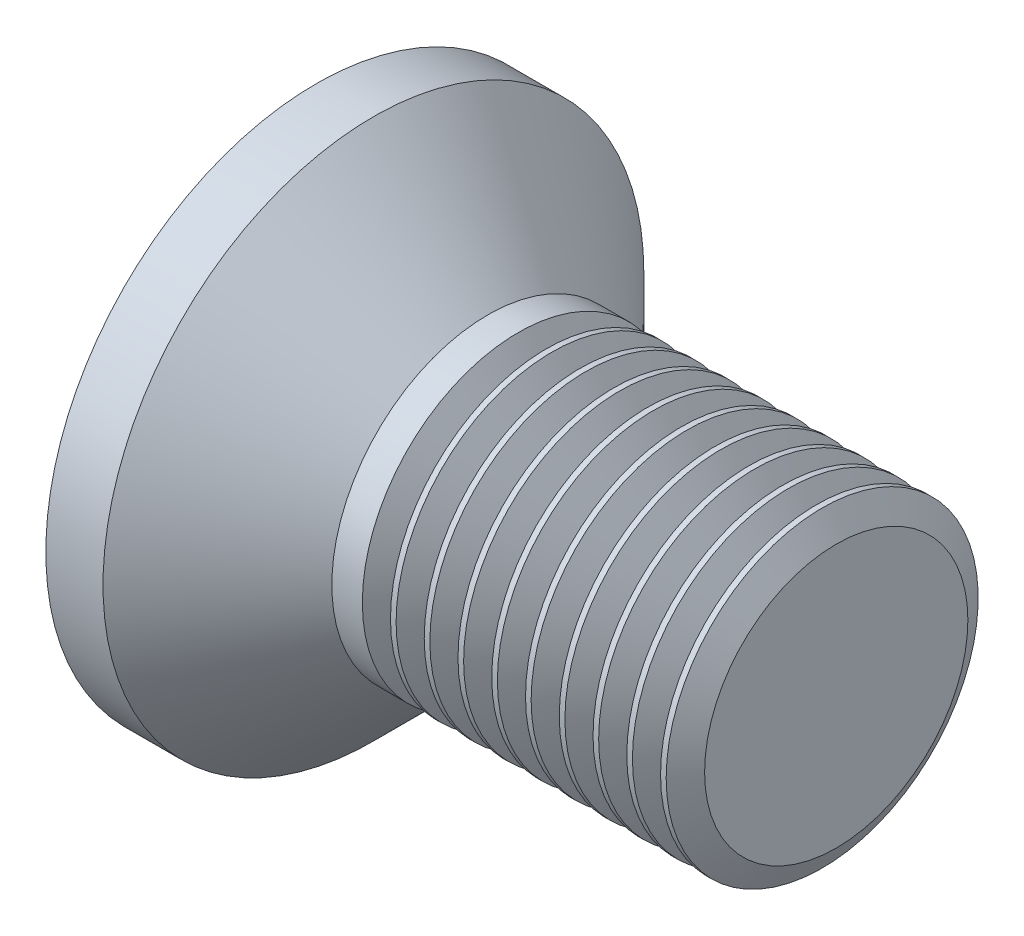
ISO-10303-21;
HEADER;
FILE_DESCRIPTION(('STEP AP214'),'2;1');
FILE_NAME('part.step','',(''),(''),'','','');
FILE_SCHEMA(('AUTOMOTIVE_DESIGN { 1 0 10303 214 1 1 1 1 }'));
ENDSEC;
DATA;
#1=APPLICATION_CONTEXT('core data for automotive mechanical design processes');
#2=APPLICATION_PROTOCOL_DEFINITION('international standard','automotive_design',2000,#1);
#3=PRODUCT_CONTEXT('',#1,'mechanical');
#4=PRODUCT('Part','Part','',(#3));
#5=PRODUCT_RELATED_PRODUCT_CATEGORY('part','',(#4));
#6=PRODUCT_DEFINITION_FORMATION('','',#4);
#7=PRODUCT_DEFINITION_CONTEXT('part definition',#1,'design');
#8=PRODUCT_DEFINITION('design','',#6,#7);
#9=PRODUCT_DEFINITION_SHAPE('','',#8);
#10=(LENGTH_UNIT() NAMED_UNIT(*) SI_UNIT(.MILLI.,.METRE.));
#11=(NAMED_UNIT(*) PLANE_ANGLE_UNIT() SI_UNIT($,.RADIAN.));
#12=(NAMED_UNIT(*) SI_UNIT($,.STERADIAN.) SOLID_ANGLE_UNIT());
#13=UNCERTAINTY_MEASURE_WITH_UNIT(LENGTH_MEASURE(1.E-05),#10,'distance_accuracy_value','');
#14=(GEOMETRIC_REPRESENTATION_CONTEXT(3) GLOBAL_UNCERTAINTY_ASSIGNED_CONTEXT((#13)) GLOBAL_UNIT_ASSIGNED_CONTEXT((#10,
#11,#12)) REPRESENTATION_CONTEXT('',''));
#15=CARTESIAN_POINT('',(0.,0.,0.));
#16=DIRECTION('',(0.,0.,1.));
#17=DIRECTION('',(1.,0.,0.));
#18=AXIS2_PLACEMENT_3D('',#15,#16,#17);
#19=CARTESIAN_POINT('',(4.51581291088132,0.,0.));
#20=DIRECTION('',(1.,0.,0.));
#21=DIRECTION('',(0.,0.,-1.));
#22=AXIS2_PLACEMENT_3D('',#19,#20,#21);
#23=CYLINDRICAL_SURFACE('',#22,1.5);
#24=CARTESIAN_POINT('',(2.26795,0.,0.));
#25=DIRECTION('',(-1.,0.,0.));
#26=DIRECTION('',(0.,0.,1.));
#27=AXIS2_PLACEMENT_3D('',#24,#25,#26);
#28=CIRCLE('',#27,1.5);
#29=CARTESIAN_POINT('',(2.26795,0.,1.5));
#30=VERTEX_POINT('',#29);
#31=EDGE_CURVE('E488',#30,#30,#28,.T.);
#32=ORIENTED_EDGE('',*,*,#31,.T.);
#33=EDGE_LOOP('',(#32));
#34=FACE_BOUND('',#33,.T.);
#35=CARTESIAN_POINT('',(2.21385,0.,0.));
#36=DIRECTION('',(-1.,0.,0.));
#37=DIRECTION('',(0.,0.,1.));
#38=AXIS2_PLACEMENT_3D('',#35,#36,#37);
#39=CIRCLE('',#38,1.5);
#40=CARTESIAN_POINT('',(2.21385,0.,1.5));
#41=VERTEX_POINT('',#40);
#42=EDGE_CURVE('E484',#41,#41,#39,.T.);
#43=ORIENTED_EDGE('',*,*,#42,.F.);
#44=EDGE_LOOP('',(#43));
#45=FACE_BOUND('',#44,.T.);
#46=ADVANCED_FACE('F37',(#34,#45),#23,.T.);
#47=CARTESIAN_POINT('',(2.59255,0.,0.));
#48=DIRECTION('',(-1.,0.,0.));
#49=DIRECTION('',(0.,0.,1.));
#50=AXIS2_PLACEMENT_3D('',#47,#48,#49);
#51=CIRCLE('',#50,1.5);
#52=CARTESIAN_POINT('',(2.59255,0.,1.5));
#53=VERTEX_POINT('',#52);
#54=EDGE_CURVE('E501',#53,#53,#51,.T.);
#55=ORIENTED_EDGE('',*,*,#54,.T.);
#56=EDGE_LOOP('',(#55));
#57=FACE_BOUND('',#56,.T.);
#58=CARTESIAN_POINT('',(2.53845,0.,0.));
#59=DIRECTION('',(-1.,0.,0.));
#60=DIRECTION('',(0.,0.,1.));
#61=AXIS2_PLACEMENT_3D('',#58,#59,#60);
#62=CIRCLE('',#61,1.5);
#63=CARTESIAN_POINT('',(2.53845,0.,1.5));
#64=VERTEX_POINT('',#63);
#65=EDGE_CURVE('E490',#64,#64,#62,.T.);
#66=ORIENTED_EDGE('',*,*,#65,.F.);
#67=EDGE_LOOP('',(#66));
#68=FACE_BOUND('',#67,.T.);
#69=ADVANCED_FACE('F242',(#57,#68),#23,.T.);
#70=CARTESIAN_POINT('',(2.91715,0.,0.));
#71=DIRECTION('',(-1.,0.,0.));
#72=DIRECTION('',(0.,0.,1.));
#73=AXIS2_PLACEMENT_3D('',#70,#71,#72);
#74=CIRCLE('',#73,1.5);
#75=CARTESIAN_POINT('',(2.91715,0.,1.5));
#76=VERTEX_POINT('',#75);
#77=EDGE_CURVE('E510',#76,#76,#74,.T.);
#78=ORIENTED_EDGE('',*,*,#77,.T.);
#79=EDGE_LOOP('',(#78));
#80=FACE_BOUND('',#79,.T.);
#81=CARTESIAN_POINT('',(2.86305,0.,0.));
#82=DIRECTION('',(-1.,0.,0.));
#83=DIRECTION('',(0.,0.,1.));
#84=AXIS2_PLACEMENT_3D('',#81,#82,#83);
#85=CIRCLE('',#84,1.5);
#86=CARTESIAN_POINT('',(2.86305,0.,1.5));
#87=VERTEX_POINT('',#86);
#88=EDGE_CURVE('E504',#87,#87,#85,.T.);
#89=ORIENTED_EDGE('',*,*,#88,.F.);
#90=EDGE_LOOP('',(#89));
#91=FACE_BOUND('',#90,.T.);
#92=ADVANCED_FACE('F250',(#80,#91),#23,.T.);
#93=CARTESIAN_POINT('',(3.24175,0.,0.));
#94=DIRECTION('',(-1.,0.,0.));
#95=DIRECTION('',(0.,0.,1.));
#96=AXIS2_PLACEMENT_3D('',#93,#94,#95);
#97=CIRCLE('',#96,1.5);
#98=CARTESIAN_POINT('',(3.24175,0.,1.5));
#99=VERTEX_POINT('',#98);
#100=EDGE_CURVE('E519',#99,#99,#97,.T.);
#101=ORIENTED_EDGE('',*,*,#100,.T.);
#102=EDGE_LOOP('',(#101));
#103=FACE_BOUND('',#102,.T.);
#104=CARTESIAN_POINT('',(3.18765,0.,0.));
#105=DIRECTION('',(-1.,0.,0.));
#106=DIRECTION('',(0.,0.,1.));
#107=AXIS2_PLACEMENT_3D('',#104,#105,#106);
#108=CIRCLE('',#107,1.5);
#109=CARTESIAN_POINT('',(3.18765,0.,1.5));
#110=VERTEX_POINT('',#109);
#111=EDGE_CURVE('E513',#110,#110,#108,.T.);
#112=ORIENTED_EDGE('',*,*,#111,.F.);
#113=EDGE_LOOP('',(#112));
#114=FACE_BOUND('',#113,.T.);
#115=ADVANCED_FACE('F559',(#103,#114),#23,.T.);
#116=CARTESIAN_POINT('',(3.56635,0.,0.));
#117=DIRECTION('',(-1.,0.,0.));
#118=DIRECTION('',(0.,0.,1.));
#119=AXIS2_PLACEMENT_3D('',#116,#117,#118);
#120=CIRCLE('',#119,1.5);
#121=CARTESIAN_POINT('',(3.56635,0.,1.5));
#122=VERTEX_POINT('',#121);
#123=EDGE_CURVE('E528',#122,#122,#120,.T.);
#124=ORIENTED_EDGE('',*,*,#123,.T.);
#125=EDGE_LOOP('',(#124));
#126=FACE_BOUND('',#125,.T.);
#127=CARTESIAN_POINT('',(3.51225,0.,0.));
#128=DIRECTION('',(-1.,0.,0.));
#129=DIRECTION('',(0.,0.,1.));
#130=AXIS2_PLACEMENT_3D('',#127,#128,#129);
#131=CIRCLE('',#130,1.5);
#132=CARTESIAN_POINT('',(3.51225,0.,1.5));
#133=VERTEX_POINT('',#132);
#134=EDGE_CURVE('E522',#133,#133,#131,.T.);
#135=ORIENTED_EDGE('',*,*,#134,.F.);
#136=EDGE_LOOP('',(#135));
#137=FACE_BOUND('',#136,.T.);
#138=ADVANCED_FACE('F550',(#126,#137),#23,.T.);
#139=CARTESIAN_POINT('',(3.89095,0.,0.));
#140=DIRECTION('',(-1.,0.,0.));
#141=DIRECTION('',(0.,0.,1.));
#142=AXIS2_PLACEMENT_3D('',#139,#140,#141);
#143=CIRCLE('',#142,1.5);
#144=CARTESIAN_POINT('',(3.89095,0.,1.5));
#145=VERTEX_POINT('',#144);
#146=EDGE_CURVE('E537',#145,#145,#143,.T.);
#147=ORIENTED_EDGE('',*,*,#146,.T.);
#148=EDGE_LOOP('',(#147));
#149=FACE_BOUND('',#148,.T.);
#150=CARTESIAN_POINT('',(3.83685,0.,0.));
#151=DIRECTION('',(-1.,0.,0.));
#152=DIRECTION('',(0.,0.,1.));
#153=AXIS2_PLACEMENT_3D('',#150,#151,#152);
#154=CIRCLE('',#153,1.5);
#155=CARTESIAN_POINT('',(3.83685,0.,1.5));
#156=VERTEX_POINT('',#155);
#157=EDGE_CURVE('E531',#156,#156,#154,.T.);
#158=ORIENTED_EDGE('',*,*,#157,.F.);
#159=EDGE_LOOP('',(#158));
#160=FACE_BOUND('',#159,.T.);
#161=ADVANCED_FACE('F286',(#149,#160),#23,.T.);
#162=CARTESIAN_POINT('',(4.21555,0.,0.));
#163=DIRECTION('',(-1.,0.,0.));
#164=DIRECTION('',(0.,0.,1.));
#165=AXIS2_PLACEMENT_3D('',#162,#163,#164);
#166=CIRCLE('',#165,1.5);
#167=CARTESIAN_POINT('',(4.21555,0.,1.5));
#168=VERTEX_POINT('',#167);
#169=EDGE_CURVE('E297',#168,#168,#166,.T.);
#170=ORIENTED_EDGE('',*,*,#169,.T.);
#171=EDGE_LOOP('',(#170));
#172=FACE_BOUND('',#171,.T.);
#173=CARTESIAN_POINT('',(4.16145,0.,0.));
#174=DIRECTION('',(-1.,0.,0.));
#175=DIRECTION('',(0.,0.,1.));
#176=AXIS2_PLACEMENT_3D('',#173,#174,#175);
#177=CIRCLE('',#176,1.5);
#178=CARTESIAN_POINT('',(4.16145,0.,1.5));
#179=VERTEX_POINT('',#178);
#180=EDGE_CURVE('E540',#179,#179,#177,.T.);
#181=ORIENTED_EDGE('',*,*,#180,.F.);
#182=EDGE_LOOP('',(#181));
#183=FACE_BOUND('',#182,.T.);
#184=ADVANCED_FACE('F277',(#172,#183),#23,.T.);
#185=CARTESIAN_POINT('',(4.54015,0.,0.));
#186=DIRECTION('',(-1.,0.,0.));
#187=DIRECTION('',(0.,0.,1.));
#188=AXIS2_PLACEMENT_3D('',#185,#186,#187);
#189=CIRCLE('',#188,1.5);
#190=CARTESIAN_POINT('',(4.54015,0.,1.5));
#191=VERTEX_POINT('',#190);
#192=EDGE_CURVE('E291',#191,#191,#189,.T.);
#193=ORIENTED_EDGE('',*,*,#192,.T.);
#194=EDGE_LOOP('',(#193));
#195=FACE_BOUND('',#194,.T.);
#196=CARTESIAN_POINT('',(4.48605,0.,0.));
#197=DIRECTION('',(-1.,0.,0.));
#198=DIRECTION('',(0.,0.,1.));
#199=AXIS2_PLACEMENT_3D('',#196,#197,#198);
#200=CIRCLE('',#199,1.5);
#201=CARTESIAN_POINT('',(4.48605,0.,1.5));
#202=VERTEX_POINT('',#201);
#203=EDGE_CURVE('E294',#202,#202,#200,.T.);
#204=ORIENTED_EDGE('',*,*,#203,.F.);
#205=EDGE_LOOP('',(#204));
#206=FACE_BOUND('',#205,.T.);
#207=ADVANCED_FACE('F262',(#195,#206),#23,.T.);
#208=CARTESIAN_POINT('',(4.54015,0.,0.));
#209=DIRECTION('',(-1.,0.,0.));
#210=DIRECTION('',(0.,0.,1.));
#211=AXIS2_PLACEMENT_3D('',#208,#209,#210);
#212=CONICAL_SURFACE('',#211,1.5,1.0471975511966);
#213=CARTESIAN_POINT('',(4.6754,0.,0.));
#214=DIRECTION('',(-1.,0.,0.));
#215=DIRECTION('',(0.,0.,1.));
#216=AXIS2_PLACEMENT_3D('',#213,#214,#215);
#217=CIRCLE('',#216,1.26574012827631);
#218=CARTESIAN_POINT('',(4.6754,0.,1.26574012827631));
#219=VERTEX_POINT('',#218);
#220=EDGE_CURVE('E310',#219,#219,#217,.T.);
#221=ORIENTED_EDGE('',*,*,#220,.T.);
#222=EDGE_LOOP('',(#221));
#223=FACE_BOUND('',#222,.T.);
#224=ORIENTED_EDGE('',*,*,#192,.F.);
#225=EDGE_LOOP('',(#224));
#226=FACE_BOUND('',#225,.T.);
#227=ADVANCED_FACE('F276',(#223,#226),#212,.T.);
#228=CARTESIAN_POINT('',(4.6754,0.,0.));
#229=DIRECTION('',(1.,0.,0.));
#230=DIRECTION('',(0.,0.,-1.));
#231=AXIS2_PLACEMENT_3D('',#228,#229,#230);
#232=CONICAL_SURFACE('',#231,1.26574012827631,1.0471975511966);
#233=CARTESIAN_POINT('',(4.81065,0.,0.));
#234=DIRECTION('',(-1.,0.,0.));
#235=DIRECTION('',(0.,0.,1.));
#236=AXIS2_PLACEMENT_3D('',#233,#234,#235);
#237=CIRCLE('',#236,1.5);
#238=CARTESIAN_POINT('',(4.81065,0.,1.5));
#239=VERTEX_POINT('',#238);
#240=EDGE_CURVE('E307',#239,#239,#237,.T.);
#241=ORIENTED_EDGE('',*,*,#240,.T.);
#242=EDGE_LOOP('',(#241));
#243=FACE_BOUND('',#242,.T.);
#244=ORIENTED_EDGE('',*,*,#220,.F.);
#245=EDGE_LOOP('',(#244));
#246=FACE_BOUND('',#245,.T.);
#247=ADVANCED_FACE('F283',(#243,#246),#232,.T.);
#248=CARTESIAN_POINT('',(5.,1.5,0.));
#249=DIRECTION('',(1.,0.,0.));
#250=DIRECTION('',(0.,0.,-1.));
#251=AXIS2_PLACEMENT_3D('',#248,#249,#250);
#252=PLANE('',#251);
#253=CARTESIAN_POINT('',(5.,0.,0.));
#254=DIRECTION('',(-1.,0.,0.));
#255=DIRECTION('',(0.,0.,1.));
#256=AXIS2_PLACEMENT_3D('',#253,#254,#255);
#257=CIRCLE('',#256,1.26574012827631);
#258=CARTESIAN_POINT('',(5.,0.,1.26574012827631));
#259=VERTEX_POINT('',#258);
#260=EDGE_CURVE('E161',#259,#259,#257,.T.);
#261=ORIENTED_EDGE('',*,*,#260,.F.);
#262=EDGE_LOOP('',(#261));
#263=FACE_BOUND('',#262,.T.);
#264=ADVANCED_FACE('F270',(#263),#252,.T.);
#265=CARTESIAN_POINT('',(4.86475,0.,0.));
#266=DIRECTION('',(-1.,0.,0.));
#267=DIRECTION('',(0.,0.,1.));
#268=AXIS2_PLACEMENT_3D('',#265,#266,#267);
#269=CONICAL_SURFACE('',#268,1.5,1.0471975511966);
#270=ORIENTED_EDGE('',*,*,#260,.T.);
#271=EDGE_LOOP('',(#270));
#272=FACE_BOUND('',#271,.T.);
#273=CARTESIAN_POINT('',(4.86475,0.,0.));
#274=DIRECTION('',(-1.,0.,0.));
#275=DIRECTION('',(0.,0.,1.));
#276=AXIS2_PLACEMENT_3D('',#273,#274,#275);
#277=CIRCLE('',#276,1.5);
#278=CARTESIAN_POINT('',(4.86475,0.,1.5));
#279=VERTEX_POINT('',#278);
#280=EDGE_CURVE('E313',#279,#279,#277,.T.);
#281=ORIENTED_EDGE('',*,*,#280,.F.);
#282=EDGE_LOOP('',(#281));
#283=FACE_BOUND('',#282,.T.);
#284=ADVANCED_FACE('F260',(#272,#283),#269,.T.);
#285=ORIENTED_EDGE('',*,*,#280,.T.);
#286=EDGE_LOOP('',(#285));
#287=FACE_BOUND('',#286,.T.);
#288=ORIENTED_EDGE('',*,*,#240,.F.);
#289=EDGE_LOOP('',(#288));
#290=FACE_BOUND('',#289,.T.);
#291=ADVANCED_FACE('F246',(#287,#290),#23,.T.);
#292=CARTESIAN_POINT('',(4.21555,0.,0.));
#293=DIRECTION('',(-1.,0.,0.));
#294=DIRECTION('',(0.,0.,1.));
#295=AXIS2_PLACEMENT_3D('',#292,#293,#294);
#296=CONICAL_SURFACE('',#295,1.5,1.0471975511966);
#297=CARTESIAN_POINT('',(4.3508,0.,0.));
#298=DIRECTION('',(-1.,0.,0.));
#299=DIRECTION('',(0.,0.,1.));
#300=AXIS2_PLACEMENT_3D('',#297,#298,#299);
#301=CIRCLE('',#300,1.26574012827631);
#302=CARTESIAN_POINT('',(4.3508,0.,1.26574012827631));
#303=VERTEX_POINT('',#302);
#304=EDGE_CURVE('E296',#303,#303,#301,.T.);
#305=ORIENTED_EDGE('',*,*,#304,.T.);
#306=EDGE_LOOP('',(#305));
#307=FACE_BOUND('',#306,.T.);
#308=ORIENTED_EDGE('',*,*,#169,.F.);
#309=EDGE_LOOP('',(#308));
#310=FACE_BOUND('',#309,.T.);
#311=ADVANCED_FACE('F259',(#307,#310),#296,.T.);
#312=CARTESIAN_POINT('',(4.3508,0.,0.));
#313=DIRECTION('',(1.,0.,0.));
#314=DIRECTION('',(0.,0.,-1.));
#315=AXIS2_PLACEMENT_3D('',#312,#313,#314);
#316=CONICAL_SURFACE('',#315,1.26574012827631,1.0471975511966);
#317=ORIENTED_EDGE('',*,*,#203,.T.);
#318=EDGE_LOOP('',(#317));
#319=FACE_BOUND('',#318,.T.);
#320=ORIENTED_EDGE('',*,*,#304,.F.);
#321=EDGE_LOOP('',(#320));
#322=FACE_BOUND('',#321,.T.);
#323=ADVANCED_FACE('F267',(#319,#322),#316,.T.);
#324=CARTESIAN_POINT('',(3.89095,0.,0.));
#325=DIRECTION('',(-1.,0.,0.));
#326=DIRECTION('',(0.,0.,1.));
#327=AXIS2_PLACEMENT_3D('',#324,#325,#326);
#328=CONICAL_SURFACE('',#327,1.5,1.0471975511966);
#329=CARTESIAN_POINT('',(4.0262,0.,0.));
#330=DIRECTION('',(-1.,0.,0.));
#331=DIRECTION('',(0.,0.,1.));
#332=AXIS2_PLACEMENT_3D('',#329,#330,#331);
#333=CIRCLE('',#332,1.26574012827631);
#334=CARTESIAN_POINT('',(4.0262,0.,1.26574012827631));
#335=VERTEX_POINT('',#334);
#336=EDGE_CURVE('E302',#335,#335,#333,.T.);
#337=ORIENTED_EDGE('',*,*,#336,.T.);
#338=EDGE_LOOP('',(#337));
#339=FACE_BOUND('',#338,.T.);
#340=ORIENTED_EDGE('',*,*,#146,.F.);
#341=EDGE_LOOP('',(#340));
#342=FACE_BOUND('',#341,.T.);
#343=ADVANCED_FACE('F425',(#339,#342),#328,.T.);
#344=CARTESIAN_POINT('',(4.0262,0.,0.));
#345=DIRECTION('',(1.,0.,0.));
#346=DIRECTION('',(0.,0.,-1.));
#347=AXIS2_PLACEMENT_3D('',#344,#345,#346);
#348=CONICAL_SURFACE('',#347,1.26574012827631,1.0471975511966);
#349=ORIENTED_EDGE('',*,*,#180,.T.);
#350=EDGE_LOOP('',(#349));
#351=FACE_BOUND('',#350,.T.);
#352=ORIENTED_EDGE('',*,*,#336,.F.);
#353=EDGE_LOOP('',(#352));
#354=FACE_BOUND('',#353,.T.);
#355=ADVANCED_FACE('F428',(#351,#354),#348,.T.);
#356=CARTESIAN_POINT('',(3.56635,0.,0.));
#357=DIRECTION('',(-1.,0.,0.));
#358=DIRECTION('',(0.,0.,1.));
#359=AXIS2_PLACEMENT_3D('',#356,#357,#358);
#360=CONICAL_SURFACE('',#359,1.5,1.0471975511966);
#361=CARTESIAN_POINT('',(3.7016,0.,0.));
#362=DIRECTION('',(-1.,0.,0.));
#363=DIRECTION('',(0.,0.,1.));
#364=AXIS2_PLACEMENT_3D('',#361,#362,#363);
#365=CIRCLE('',#364,1.26574012827631);
#366=CARTESIAN_POINT('',(3.7016,0.,1.26574012827631));
#367=VERTEX_POINT('',#366);
#368=EDGE_CURVE('E534',#367,#367,#365,.T.);
#369=ORIENTED_EDGE('',*,*,#368,.T.);
#370=EDGE_LOOP('',(#369));
#371=FACE_BOUND('',#370,.T.);
#372=ORIENTED_EDGE('',*,*,#123,.F.);
#373=EDGE_LOOP('',(#372));
#374=FACE_BOUND('',#373,.T.);
#375=ADVANCED_FACE('F432',(#371,#374),#360,.T.);
#376=CARTESIAN_POINT('',(3.7016,0.,0.));
#377=DIRECTION('',(1.,0.,0.));
#378=DIRECTION('',(0.,0.,-1.));
#379=AXIS2_PLACEMENT_3D('',#376,#377,#378);
#380=CONICAL_SURFACE('',#379,1.26574012827631,1.0471975511966);
#381=ORIENTED_EDGE('',*,*,#157,.T.);
#382=EDGE_LOOP('',(#381));
#383=FACE_BOUND('',#382,.T.);
#384=ORIENTED_EDGE('',*,*,#368,.F.);
#385=EDGE_LOOP('',(#384));
#386=FACE_BOUND('',#385,.T.);
#387=ADVANCED_FACE('F436',(#383,#386),#380,.T.);
#388=CARTESIAN_POINT('',(3.24175,0.,0.));
#389=DIRECTION('',(-1.,0.,0.));
#390=DIRECTION('',(0.,0.,1.));
#391=AXIS2_PLACEMENT_3D('',#388,#389,#390);
#392=CONICAL_SURFACE('',#391,1.5,1.0471975511966);
#393=CARTESIAN_POINT('',(3.377,0.,0.));
#394=DIRECTION('',(-1.,0.,0.));
#395=DIRECTION('',(0.,0.,1.));
#396=AXIS2_PLACEMENT_3D('',#393,#394,#395);
#397=CIRCLE('',#396,1.26574012827631);
#398=CARTESIAN_POINT('',(3.377,0.,1.26574012827631));
#399=VERTEX_POINT('',#398);
#400=EDGE_CURVE('E525',#399,#399,#397,.T.);
#401=ORIENTED_EDGE('',*,*,#400,.T.);
#402=EDGE_LOOP('',(#401));
#403=FACE_BOUND('',#402,.T.);
#404=ORIENTED_EDGE('',*,*,#100,.F.);
#405=EDGE_LOOP('',(#404));
#406=FACE_BOUND('',#405,.T.);
#407=ADVANCED_FACE('F440',(#403,#406),#392,.T.);
#408=CARTESIAN_POINT('',(3.377,0.,0.));
#409=DIRECTION('',(1.,0.,0.));
#410=DIRECTION('',(0.,0.,-1.));
#411=AXIS2_PLACEMENT_3D('',#408,#409,#410);
#412=CONICAL_SURFACE('',#411,1.26574012827631,1.0471975511966);
#413=ORIENTED_EDGE('',*,*,#134,.T.);
#414=EDGE_LOOP('',(#413));
#415=FACE_BOUND('',#414,.T.);
#416=ORIENTED_EDGE('',*,*,#400,.F.);
#417=EDGE_LOOP('',(#416));
#418=FACE_BOUND('',#417,.T.);
#419=ADVANCED_FACE('F444',(#415,#418),#412,.T.);
#420=CARTESIAN_POINT('',(2.91715,0.,0.));
#421=DIRECTION('',(-1.,0.,0.));
#422=DIRECTION('',(0.,0.,1.));
#423=AXIS2_PLACEMENT_3D('',#420,#421,#422);
#424=CONICAL_SURFACE('',#423,1.5,1.0471975511966);
#425=CARTESIAN_POINT('',(3.0524,0.,0.));
#426=DIRECTION('',(-1.,0.,0.));
#427=DIRECTION('',(0.,0.,1.));
#428=AXIS2_PLACEMENT_3D('',#425,#426,#427);
#429=CIRCLE('',#428,1.26574012827631);
#430=CARTESIAN_POINT('',(3.0524,0.,1.26574012827631));
#431=VERTEX_POINT('',#430);
#432=EDGE_CURVE('E516',#431,#431,#429,.T.);
#433=ORIENTED_EDGE('',*,*,#432,.T.);
#434=EDGE_LOOP('',(#433));
#435=FACE_BOUND('',#434,.T.);
#436=ORIENTED_EDGE('',*,*,#77,.F.);
#437=EDGE_LOOP('',(#436));
#438=FACE_BOUND('',#437,.T.);
#439=ADVANCED_FACE('F448',(#435,#438),#424,.T.);
#440=CARTESIAN_POINT('',(3.0524,0.,0.));
#441=DIRECTION('',(1.,0.,0.));
#442=DIRECTION('',(0.,0.,-1.));
#443=AXIS2_PLACEMENT_3D('',#440,#441,#442);
#444=CONICAL_SURFACE('',#443,1.26574012827631,1.0471975511966);
#445=ORIENTED_EDGE('',*,*,#111,.T.);
#446=EDGE_LOOP('',(#445));
#447=FACE_BOUND('',#446,.T.);
#448=ORIENTED_EDGE('',*,*,#432,.F.);
#449=EDGE_LOOP('',(#448));
#450=FACE_BOUND('',#449,.T.);
#451=ADVANCED_FACE('F452',(#447,#450),#444,.T.);
#452=CARTESIAN_POINT('',(2.59255,0.,0.));
#453=DIRECTION('',(-1.,0.,0.));
#454=DIRECTION('',(0.,0.,1.));
#455=AXIS2_PLACEMENT_3D('',#452,#453,#454);
#456=CONICAL_SURFACE('',#455,1.5,1.0471975511966);
#457=CARTESIAN_POINT('',(2.7278,0.,0.));
#458=DIRECTION('',(-1.,0.,0.));
#459=DIRECTION('',(0.,0.,1.));
#460=AXIS2_PLACEMENT_3D('',#457,#458,#459);
#461=CIRCLE('',#460,1.26574012827631);
#462=CARTESIAN_POINT('',(2.7278,0.,1.26574012827631));
#463=VERTEX_POINT('',#462);
#464=EDGE_CURVE('E507',#463,#463,#461,.T.);
#465=ORIENTED_EDGE('',*,*,#464,.T.);
#466=EDGE_LOOP('',(#465));
#467=FACE_BOUND('',#466,.T.);
#468=ORIENTED_EDGE('',*,*,#54,.F.);
#469=EDGE_LOOP('',(#468));
#470=FACE_BOUND('',#469,.T.);
#471=ADVANCED_FACE('F456',(#467,#470),#456,.T.);
#472=CARTESIAN_POINT('',(2.7278,0.,0.));
#473=DIRECTION('',(1.,0.,0.));
#474=DIRECTION('',(0.,0.,-1.));
#475=AXIS2_PLACEMENT_3D('',#472,#473,#474);
#476=CONICAL_SURFACE('',#475,1.26574012827631,1.0471975511966);
#477=ORIENTED_EDGE('',*,*,#88,.T.);
#478=EDGE_LOOP('',(#477));
#479=FACE_BOUND('',#478,.T.);
#480=ORIENTED_EDGE('',*,*,#464,.F.);
#481=EDGE_LOOP('',(#480));
#482=FACE_BOUND('',#481,.T.);
#483=ADVANCED_FACE('F460',(#479,#482),#476,.T.);
#484=CARTESIAN_POINT('',(2.26795,0.,0.));
#485=DIRECTION('',(-1.,0.,0.));
#486=DIRECTION('',(0.,0.,1.));
#487=AXIS2_PLACEMENT_3D('',#484,#485,#486);
#488=CONICAL_SURFACE('',#487,1.5,1.0471975511966);
#489=CARTESIAN_POINT('',(2.4032,0.,0.));
#490=DIRECTION('',(-1.,0.,0.));
#491=DIRECTION('',(0.,0.,1.));
#492=AXIS2_PLACEMENT_3D('',#489,#490,#491);
#493=CIRCLE('',#492,1.26574012827631);
#494=CARTESIAN_POINT('',(2.4032,0.,1.26574012827631));
#495=VERTEX_POINT('',#494);
#496=EDGE_CURVE('E498',#495,#495,#493,.T.);
#497=ORIENTED_EDGE('',*,*,#496,.T.);
#498=EDGE_LOOP('',(#497));
#499=FACE_BOUND('',#498,.T.);
#500=ORIENTED_EDGE('',*,*,#31,.F.);
#501=EDGE_LOOP('',(#500));
#502=FACE_BOUND('',#501,.T.);
#503=ADVANCED_FACE('F464',(#499,#502),#488,.T.);
#504=CARTESIAN_POINT('',(2.4032,0.,0.));
#505=DIRECTION('',(1.,0.,0.));
#506=DIRECTION('',(0.,0.,-1.));
#507=AXIS2_PLACEMENT_3D('',#504,#505,#506);
#508=CONICAL_SURFACE('',#507,1.26574012827631,1.0471975511966);
#509=ORIENTED_EDGE('',*,*,#65,.T.);
#510=EDGE_LOOP('',(#509));
#511=FACE_BOUND('',#510,.T.);
#512=ORIENTED_EDGE('',*,*,#496,.F.);
#513=EDGE_LOOP('',(#512));
#514=FACE_BOUND('',#513,.T.);
#515=ADVANCED_FACE('F468',(#511,#514),#508,.T.);
#516=CARTESIAN_POINT('',(1.94335,0.,0.));
#517=DIRECTION('',(-1.,0.,0.));
#518=DIRECTION('',(0.,0.,1.));
#519=AXIS2_PLACEMENT_3D('',#516,#517,#518);
#520=CONICAL_SURFACE('',#519,1.5,1.0471975511966);
#521=CARTESIAN_POINT('',(2.0786,0.,0.));
#522=DIRECTION('',(-1.,0.,0.));
#523=DIRECTION('',(0.,0.,1.));
#524=AXIS2_PLACEMENT_3D('',#521,#522,#523);
#525=CIRCLE('',#524,1.26574012827631);
#526=CARTESIAN_POINT('',(2.0786,0.,1.26574012827631));
#527=VERTEX_POINT('',#526);
#528=EDGE_CURVE('E487',#527,#527,#525,.T.);
#529=ORIENTED_EDGE('',*,*,#528,.T.);
#530=EDGE_LOOP('',(#529));
#531=FACE_BOUND('',#530,.T.);
#532=CARTESIAN_POINT('',(1.94335,0.,0.));
#533=DIRECTION('',(-1.,0.,0.));
#534=DIRECTION('',(0.,0.,1.));
#535=AXIS2_PLACEMENT_3D('',#532,#533,#534);
#536=CIRCLE('',#535,1.5);
#537=CARTESIAN_POINT('',(1.94335,0.,1.5));
#538=VERTEX_POINT('',#537);
#539=EDGE_CURVE('E492',#538,#538,#536,.T.);
#540=ORIENTED_EDGE('',*,*,#539,.F.);
#541=EDGE_LOOP('',(#540));
#542=FACE_BOUND('',#541,.T.);
#543=ADVANCED_FACE('F472',(#531,#542),#520,.T.);
#544=CARTESIAN_POINT('',(2.0786,0.,0.));
#545=DIRECTION('',(1.,0.,0.));
#546=DIRECTION('',(0.,0.,-1.));
#547=AXIS2_PLACEMENT_3D('',#544,#545,#546);
#548=CONICAL_SURFACE('',#547,1.26574012827631,1.0471975511966);
#549=ORIENTED_EDGE('',*,*,#42,.T.);
#550=EDGE_LOOP('',(#549));
#551=FACE_BOUND('',#550,.T.);
#552=ORIENTED_EDGE('',*,*,#528,.F.);
#553=EDGE_LOOP('',(#552));
#554=FACE_BOUND('',#553,.T.);
#555=ADVANCED_FACE('F418',(#551,#554),#548,.T.);
#556=CARTESIAN_POINT('',(0.825,0.32,0.32));
#557=DIRECTION('',(1.,0.,0.));
#558=DIRECTION('',(0.,0.,-1.));
#559=AXIS2_PLACEMENT_3D('',#556,#557,#558);
#560=PLANE('',#559);
#561=DIRECTION('',(0.,0.,1.));
#562=VECTOR('',#561,1.);
#563=CARTESIAN_POINT('',(0.825,0.32,0.32));
#564=LINE('',#563,#562);
#565=CARTESIAN_POINT('',(0.825,0.32,0.62));
#566=VERTEX_POINT('',#565);
#567=CARTESIAN_POINT('',(0.825,0.32,1.12368602791856));
#568=VERTEX_POINT('',#567);
#569=EDGE_CURVE('E174',#566,#568,#564,.T.);
#570=ORIENTED_EDGE('',*,*,#569,.F.);
#571=CARTESIAN_POINT('',(0.825,0.62,0.62));
#572=DIRECTION('',(1.,0.,0.));
#573=DIRECTION('',(0.,0.,-1.));
#574=AXIS2_PLACEMENT_3D('',#571,#572,#573);
#575=CIRCLE('',#574,0.3);
#576=CARTESIAN_POINT('',(0.825,0.62,0.32));
#577=VERTEX_POINT('',#576);
#578=EDGE_CURVE('E45',#566,#577,#575,.T.);
#579=ORIENTED_EDGE('',*,*,#578,.T.);
#580=DIRECTION('',(0.,-1.,0.));
#581=VECTOR('',#580,1.);
#582=CARTESIAN_POINT('',(0.825,0.32,0.32));
#583=LINE('',#582,#581);
#584=CARTESIAN_POINT('',(0.825,1.12368602791856,0.32));
#585=VERTEX_POINT('',#584);
#586=EDGE_CURVE('E221',#585,#577,#583,.T.);
#587=ORIENTED_EDGE('',*,*,#586,.F.);
#588=DIRECTION('',(0.,0.,1.));
#589=VECTOR('',#588,1.);
#590=CARTESIAN_POINT('',(0.825,1.12368602791856,-0.32));
#591=LINE('',#590,#589);
#592=CARTESIAN_POINT('',(0.825,1.12368602791856,-0.32));
#593=VERTEX_POINT('',#592);
#594=EDGE_CURVE('E229',#593,#585,#591,.T.);
#595=ORIENTED_EDGE('',*,*,#594,.F.);
#596=DIRECTION('',(0.,1.,0.));
#597=VECTOR('',#596,1.);
#598=CARTESIAN_POINT('',(0.825,0.32,-0.32));
#599=LINE('',#598,#597);
#600=CARTESIAN_POINT('',(0.825,0.62,-0.32));
#601=VERTEX_POINT('',#600);
#602=EDGE_CURVE('E333',#601,#593,#599,.T.);
#603=ORIENTED_EDGE('',*,*,#602,.F.);
#604=CARTESIAN_POINT('',(0.825,0.62,-0.62));
#605=DIRECTION('',(1.,0.,0.));
#606=DIRECTION('',(0.,0.,-1.));
#607=AXIS2_PLACEMENT_3D('',#604,#605,#606);
#608=CIRCLE('',#607,0.3);
#609=CARTESIAN_POINT('',(0.825,0.32,-0.62));
#610=VERTEX_POINT('',#609);
#611=EDGE_CURVE('E215',#601,#610,#608,.T.);
#612=ORIENTED_EDGE('',*,*,#611,.T.);
#613=DIRECTION('',(0.,0.,1.));
#614=VECTOR('',#613,1.);
#615=CARTESIAN_POINT('',(0.825,0.32,-0.32));
#616=LINE('',#615,#614);
#617=CARTESIAN_POINT('',(0.825,0.32,-1.12368602791856));
#618=VERTEX_POINT('',#617);
#619=EDGE_CURVE('E330',#618,#610,#616,.T.);
#620=ORIENTED_EDGE('',*,*,#619,.F.);
#621=DIRECTION('',(0.,1.,0.));
#622=VECTOR('',#621,1.);
#623=CARTESIAN_POINT('',(0.825,0.32,-1.12368602791856));
#624=LINE('',#623,#622);
#625=CARTESIAN_POINT('',(0.825,-0.32,-1.12368602791856));
#626=VERTEX_POINT('',#625);
#627=EDGE_CURVE('E329',#626,#618,#624,.T.);
#628=ORIENTED_EDGE('',*,*,#627,.F.);
#629=DIRECTION('',(0.,0.,-1.));
#630=VECTOR('',#629,1.);
#631=CARTESIAN_POINT('',(0.825,-0.32,-0.32));
#632=LINE('',#631,#630);
#633=CARTESIAN_POINT('',(0.825,-0.32,-0.62));
#634=VERTEX_POINT('',#633);
#635=EDGE_CURVE('E327',#634,#626,#632,.T.);
#636=ORIENTED_EDGE('',*,*,#635,.F.);
#637=CARTESIAN_POINT('',(0.825,-0.62,-0.62));
#638=DIRECTION('',(1.,0.,0.));
#639=DIRECTION('',(0.,0.,-1.));
#640=AXIS2_PLACEMENT_3D('',#637,#638,#639);
#641=CIRCLE('',#640,0.3);
#642=CARTESIAN_POINT('',(0.825,-0.62,-0.32));
#643=VERTEX_POINT('',#642);
#644=EDGE_CURVE('E213',#634,#643,#641,.T.);
#645=ORIENTED_EDGE('',*,*,#644,.T.);
#646=DIRECTION('',(0.,1.,0.));
#647=VECTOR('',#646,1.);
#648=CARTESIAN_POINT('',(0.825,-0.32,-0.32));
#649=LINE('',#648,#647);
#650=CARTESIAN_POINT('',(0.825,-1.12368602791856,-0.32));
#651=VERTEX_POINT('',#650);
#652=EDGE_CURVE('E324',#651,#643,#649,.T.);
#653=ORIENTED_EDGE('',*,*,#652,.F.);
#654=DIRECTION('',(0.,0.,-1.));
#655=VECTOR('',#654,1.);
#656=CARTESIAN_POINT('',(0.825,-1.12368602791856,-0.32));
#657=LINE('',#656,#655);
#658=CARTESIAN_POINT('',(0.825,-1.12368602791856,0.32));
#659=VERTEX_POINT('',#658);
#660=EDGE_CURVE('E323',#659,#651,#657,.T.);
#661=ORIENTED_EDGE('',*,*,#660,.F.);
#662=DIRECTION('',(0.,-1.,0.));
#663=VECTOR('',#662,1.);
#664=CARTESIAN_POINT('',(0.825,-0.32,0.32));
#665=LINE('',#664,#663);
#666=CARTESIAN_POINT('',(0.825,-0.62,0.32));
#667=VERTEX_POINT('',#666);
#668=EDGE_CURVE('E321',#667,#659,#665,.T.);
#669=ORIENTED_EDGE('',*,*,#668,.F.);
#670=CARTESIAN_POINT('',(0.825,-0.62,0.62));
#671=DIRECTION('',(1.,0.,0.));
#672=DIRECTION('',(0.,0.,-1.));
#673=AXIS2_PLACEMENT_3D('',#670,#671,#672);
#674=CIRCLE('',#673,0.3);
#675=CARTESIAN_POINT('',(0.825,-0.32,0.62));
#676=VERTEX_POINT('',#675);
#677=EDGE_CURVE('E11',#667,#676,#674,.T.);
#678=ORIENTED_EDGE('',*,*,#677,.T.);
#679=DIRECTION('',(0.,0.,-1.));
#680=VECTOR('',#679,1.);
#681=CARTESIAN_POINT('',(0.825,-0.32,0.32));
#682=LINE('',#681,#680);
#683=CARTESIAN_POINT('',(0.825,-0.32,1.12368602791856));
#684=VERTEX_POINT('',#683);
#685=EDGE_CURVE('E319',#684,#676,#682,.T.);
#686=ORIENTED_EDGE('',*,*,#685,.F.);
#687=DIRECTION('',(0.,-1.,0.));
#688=VECTOR('',#687,1.);
#689=CARTESIAN_POINT('',(0.825,0.32,1.12368602791856));
#690=LINE('',#689,#688);
#691=EDGE_CURVE('E185',#568,#684,#690,.T.);
#692=ORIENTED_EDGE('',*,*,#691,.F.);
#693=EDGE_LOOP('',(#570,#579,#587,#595,#603,#612,#620,#628,#636,#645,#653,#661,#669,#678,#686,#692));
#694=FACE_BOUND('',#693,.T.);
#695=ADVANCED_FACE('F219',(#694),#560,.F.);
#696=CARTESIAN_POINT('',(0.,-1.6,-0.32));
#697=DIRECTION('',(-0.500000000000001,0.866025403784438,0.));
#698=DIRECTION('',(-0.866025403784438,-0.500000000000001,0.));
#699=AXIS2_PLACEMENT_3D('',#696,#697,#698);
#700=PLANE('',#699);
#701=DIRECTION('',(0.,0.,-1.));
#702=VECTOR('',#701,1.);
#703=CARTESIAN_POINT('',(0.,-1.6,-0.32));
#704=LINE('',#703,#702);
#705=CARTESIAN_POINT('',(0.,-1.6,0.319999999999999));
#706=VERTEX_POINT('',#705);
#707=CARTESIAN_POINT('',(0.,-1.6,-0.32));
#708=VERTEX_POINT('',#707);
#709=EDGE_CURVE('E338',#706,#708,#704,.T.);
#710=ORIENTED_EDGE('',*,*,#709,.F.);
#711=DIRECTION('',(-0.866025403784438,-0.500000000000001,0.));
#712=VECTOR('',#711,1.);
#713=CARTESIAN_POINT('',(0.,-1.6,0.319999999999999));
#714=LINE('',#713,#712);
#715=EDGE_CURVE('E181',#659,#706,#714,.T.);
#716=ORIENTED_EDGE('',*,*,#715,.F.);
#717=ORIENTED_EDGE('',*,*,#660,.T.);
#718=DIRECTION('',(-0.866025403784438,-0.500000000000001,0.));
#719=VECTOR('',#718,1.);
#720=CARTESIAN_POINT('',(1.17300625842204,-0.922764520938918,-0.32));
#721=LINE('',#720,#719);
#722=EDGE_CURVE('E372',#651,#708,#721,.T.);
#723=ORIENTED_EDGE('',*,*,#722,.T.);
#724=EDGE_LOOP('',(#710,#716,#717,#723));
#725=FACE_BOUND('',#724,.T.);
#726=ADVANCED_FACE('F381',(#725),#700,.T.);
#727=CARTESIAN_POINT('',(0.825,-0.32,0.32));
#728=DIRECTION('',(0.,0.,-1.));
#729=DIRECTION('',(0.,1.,0.));
#730=AXIS2_PLACEMENT_3D('',#727,#728,#729);
#731=PLANE('',#730);
#732=DIRECTION('',(0.,-1.,0.));
#733=VECTOR('',#732,1.);
#734=CARTESIAN_POINT('',(0.,-0.32,0.32));
#735=LINE('',#734,#733);
#736=CARTESIAN_POINT('',(0.,-0.62,0.32));
#737=VERTEX_POINT('',#736);
#738=EDGE_CURVE('E336',#737,#706,#735,.T.);
#739=ORIENTED_EDGE('',*,*,#738,.F.);
#740=DIRECTION('',(-1.,0.,0.));
#741=VECTOR('',#740,1.);
#742=CARTESIAN_POINT('',(0.825,-0.62,0.32));
#743=LINE('',#742,#741);
#744=EDGE_CURVE('E52',#737,#667,#743,.F.);
#745=ORIENTED_EDGE('',*,*,#744,.T.);
#746=ORIENTED_EDGE('',*,*,#668,.T.);
#747=ORIENTED_EDGE('',*,*,#715,.T.);
#748=EDGE_LOOP('',(#739,#745,#746,#747));
#749=FACE_BOUND('',#748,.T.);
#750=ADVANCED_FACE('F378',(#749),#731,.T.);
#751=CARTESIAN_POINT('',(0.825,-0.62,0.62));
#752=DIRECTION('',(-1.,0.,0.));
#753=DIRECTION('',(0.,0.,1.));
#754=AXIS2_PLACEMENT_3D('',#751,#752,#753);
#755=CYLINDRICAL_SURFACE('',#754,0.3);
#756=ORIENTED_EDGE('',*,*,#677,.F.);
#757=ORIENTED_EDGE('',*,*,#744,.F.);
#758=CARTESIAN_POINT('',(0.,-0.62,0.62));
#759=DIRECTION('',(-1.,0.,0.));
#760=DIRECTION('',(0.,0.,1.));
#761=AXIS2_PLACEMENT_3D('',#758,#759,#760);
#762=CIRCLE('',#761,0.3);
#763=CARTESIAN_POINT('',(0.,-0.32,0.62));
#764=VERTEX_POINT('',#763);
#765=EDGE_CURVE('E189',#764,#737,#762,.T.);
#766=ORIENTED_EDGE('',*,*,#765,.F.);
#767=DIRECTION('',(-1.,0.,0.));
#768=VECTOR('',#767,1.);
#769=CARTESIAN_POINT('',(0.825,-0.32,0.62));
#770=LINE('',#769,#768);
#771=EDGE_CURVE('E209',#676,#764,#770,.T.);
#772=ORIENTED_EDGE('',*,*,#771,.F.);
#773=EDGE_LOOP('',(#756,#757,#766,#772));
#774=FACE_BOUND('',#773,.T.);
#775=ADVANCED_FACE('F39',(#774),#755,.T.);
#776=CARTESIAN_POINT('',(0.825,-0.32,0.32));
#777=DIRECTION('',(0.,1.,0.));
#778=DIRECTION('',(0.,0.,1.));
#779=AXIS2_PLACEMENT_3D('',#776,#777,#778);
#780=PLANE('',#779);
#781=ORIENTED_EDGE('',*,*,#685,.T.);
#782=ORIENTED_EDGE('',*,*,#771,.T.);
#783=DIRECTION('',(0.,0.,-1.));
#784=VECTOR('',#783,1.);
#785=CARTESIAN_POINT('',(0.,-0.32,0.32));
#786=LINE('',#785,#784);
#787=CARTESIAN_POINT('',(0.,-0.32,1.6));
#788=VERTEX_POINT('',#787);
#789=EDGE_CURVE('E170',#788,#764,#786,.T.);
#790=ORIENTED_EDGE('',*,*,#789,.F.);
#791=DIRECTION('',(-0.866025403784438,0.,0.500000000000001));
#792=VECTOR('',#791,1.);
#793=CARTESIAN_POINT('',(1.17300625842204,-0.32,0.922764520938917));
#794=LINE('',#793,#792);
#795=EDGE_CURVE('E168',#684,#788,#794,.T.);
#796=ORIENTED_EDGE('',*,*,#795,.F.);
#797=EDGE_LOOP('',(#781,#782,#790,#796));
#798=FACE_BOUND('',#797,.T.);
#799=ADVANCED_FACE('F387',(#798),#780,.T.);
#800=CARTESIAN_POINT('',(0.,0.32,1.6));
#801=DIRECTION('',(-0.500000000000001,0.,-0.866025403784438));
#802=DIRECTION('',(-0.866025403784438,0.,0.500000000000001));
#803=AXIS2_PLACEMENT_3D('',#800,#801,#802);
#804=PLANE('',#803);
#805=DIRECTION('',(0.,-1.,0.));
#806=VECTOR('',#805,1.);
#807=CARTESIAN_POINT('',(0.,0.32,1.6));
#808=LINE('',#807,#806);
#809=CARTESIAN_POINT('',(0.,0.32,1.6));
#810=VERTEX_POINT('',#809);
#811=EDGE_CURVE('E155',#810,#788,#808,.T.);
#812=ORIENTED_EDGE('',*,*,#811,.F.);
#813=DIRECTION('',(-0.866025403784438,0.,0.500000000000001));
#814=VECTOR('',#813,1.);
#815=CARTESIAN_POINT('',(0.,0.32,1.6));
#816=LINE('',#815,#814);
#817=EDGE_CURVE('E166',#568,#810,#816,.T.);
#818=ORIENTED_EDGE('',*,*,#817,.F.);
#819=ORIENTED_EDGE('',*,*,#691,.T.);
#820=ORIENTED_EDGE('',*,*,#795,.T.);
#821=EDGE_LOOP('',(#812,#818,#819,#820));
#822=FACE_BOUND('',#821,.T.);
#823=ADVANCED_FACE('F165',(#822),#804,.T.);
#824=CARTESIAN_POINT('',(0.825,0.32,0.32));
#825=DIRECTION('',(0.,-1.,0.));
#826=DIRECTION('',(0.,0.,-1.));
#827=AXIS2_PLACEMENT_3D('',#824,#825,#826);
#828=PLANE('',#827);
#829=DIRECTION('',(0.,0.,1.));
#830=VECTOR('',#829,1.);
#831=CARTESIAN_POINT('',(0.,0.32,0.32));
#832=LINE('',#831,#830);
#833=CARTESIAN_POINT('',(0.,0.32,0.62));
#834=VERTEX_POINT('',#833);
#835=EDGE_CURVE('E150',#834,#810,#832,.T.);
#836=ORIENTED_EDGE('',*,*,#835,.F.);
#837=DIRECTION('',(-1.,0.,0.));
#838=VECTOR('',#837,1.);
#839=CARTESIAN_POINT('',(0.825,0.32,0.62));
#840=LINE('',#839,#838);
#841=EDGE_CURVE('E207',#834,#566,#840,.F.);
#842=ORIENTED_EDGE('',*,*,#841,.T.);
#843=ORIENTED_EDGE('',*,*,#569,.T.);
#844=ORIENTED_EDGE('',*,*,#817,.T.);
#845=EDGE_LOOP('',(#836,#842,#843,#844));
#846=FACE_BOUND('',#845,.T.);
#847=ADVANCED_FACE('F172',(#846),#828,.T.);
#848=CARTESIAN_POINT('',(0.825,0.62,0.62));
#849=DIRECTION('',(-1.,0.,0.));
#850=DIRECTION('',(0.,0.,1.));
#851=AXIS2_PLACEMENT_3D('',#848,#849,#850);
#852=CYLINDRICAL_SURFACE('',#851,0.3);
#853=ORIENTED_EDGE('',*,*,#578,.F.);
#854=ORIENTED_EDGE('',*,*,#841,.F.);
#855=CARTESIAN_POINT('',(0.,0.62,0.62));
#856=DIRECTION('',(-1.,0.,0.));
#857=DIRECTION('',(0.,0.,1.));
#858=AXIS2_PLACEMENT_3D('',#855,#856,#857);
#859=CIRCLE('',#858,0.3);
#860=CARTESIAN_POINT('',(0.,0.62,0.32));
#861=VERTEX_POINT('',#860);
#862=EDGE_CURVE('E157',#861,#834,#859,.T.);
#863=ORIENTED_EDGE('',*,*,#862,.F.);
#864=DIRECTION('',(-1.,0.,0.));
#865=VECTOR('',#864,1.);
#866=CARTESIAN_POINT('',(0.825,0.62,0.32));
#867=LINE('',#866,#865);
#868=EDGE_CURVE('E204',#577,#861,#867,.T.);
#869=ORIENTED_EDGE('',*,*,#868,.F.);
#870=EDGE_LOOP('',(#853,#854,#863,#869));
#871=FACE_BOUND('',#870,.T.);
#872=ADVANCED_FACE('F231',(#871),#852,.T.);
#873=CARTESIAN_POINT('',(0.825,0.32,0.32));
#874=DIRECTION('',(0.,0.,-1.));
#875=DIRECTION('',(0.,1.,0.));
#876=AXIS2_PLACEMENT_3D('',#873,#874,#875);
#877=PLANE('',#876);
#878=ORIENTED_EDGE('',*,*,#586,.T.);
#879=ORIENTED_EDGE('',*,*,#868,.T.);
#880=DIRECTION('',(0.,-1.,0.));
#881=VECTOR('',#880,1.);
#882=CARTESIAN_POINT('',(0.,0.32,0.32));
#883=LINE('',#882,#881);
#884=CARTESIAN_POINT('',(0.,1.6,0.32));
#885=VERTEX_POINT('',#884);
#886=EDGE_CURVE('E318',#885,#861,#883,.T.);
#887=ORIENTED_EDGE('',*,*,#886,.F.);
#888=DIRECTION('',(-0.866025403784438,0.500000000000001,0.));
#889=VECTOR('',#888,1.);
#890=CARTESIAN_POINT('',(1.17300625842204,0.922764520938918,0.32));
#891=LINE('',#890,#889);
#892=EDGE_CURVE('E228',#585,#885,#891,.T.);
#893=ORIENTED_EDGE('',*,*,#892,.F.);
#894=EDGE_LOOP('',(#878,#879,#887,#893));
#895=FACE_BOUND('',#894,.T.);
#896=ADVANCED_FACE('F226',(#895),#877,.T.);
#897=CARTESIAN_POINT('',(0.,1.6,-0.32));
#898=DIRECTION('',(-0.500000000000001,-0.866025403784438,0.));
#899=DIRECTION('',(0.866025403784438,-0.500000000000001,0.));
#900=AXIS2_PLACEMENT_3D('',#897,#898,#899);
#901=PLANE('',#900);
#902=DIRECTION('',(0.,0.,1.));
#903=VECTOR('',#902,1.);
#904=CARTESIAN_POINT('',(0.,1.6,-0.32));
#905=LINE('',#904,#903);
#906=CARTESIAN_POINT('',(0.,1.6,-0.32));
#907=VERTEX_POINT('',#906);
#908=EDGE_CURVE('E353',#907,#885,#905,.T.);
#909=ORIENTED_EDGE('',*,*,#908,.F.);
#910=DIRECTION('',(-0.866025403784438,0.500000000000001,0.));
#911=VECTOR('',#910,1.);
#912=CARTESIAN_POINT('',(0.,1.6,-0.32));
#913=LINE('',#912,#911);
#914=EDGE_CURVE('E362',#593,#907,#913,.T.);
#915=ORIENTED_EDGE('',*,*,#914,.F.);
#916=ORIENTED_EDGE('',*,*,#594,.T.);
#917=ORIENTED_EDGE('',*,*,#892,.T.);
#918=EDGE_LOOP('',(#909,#915,#916,#917));
#919=FACE_BOUND('',#918,.T.);
#920=ADVANCED_FACE('F237',(#919),#901,.T.);
#921=CARTESIAN_POINT('',(0.825,0.32,-0.32));
#922=DIRECTION('',(0.,0.,1.));
#923=DIRECTION('',(1.,0.,0.));
#924=AXIS2_PLACEMENT_3D('',#921,#922,#923);
#925=PLANE('',#924);
#926=DIRECTION('',(0.,1.,0.));
#927=VECTOR('',#926,1.);
#928=CARTESIAN_POINT('',(0.,0.32,-0.32));
#929=LINE('',#928,#927);
#930=CARTESIAN_POINT('',(0.,0.62,-0.32));
#931=VERTEX_POINT('',#930);
#932=EDGE_CURVE('E351',#931,#907,#929,.T.);
#933=ORIENTED_EDGE('',*,*,#932,.F.);
#934=DIRECTION('',(-1.,0.,0.));
#935=VECTOR('',#934,1.);
#936=CARTESIAN_POINT('',(0.825,0.62,-0.32));
#937=LINE('',#936,#935);
#938=EDGE_CURVE('E202',#931,#601,#937,.F.);
#939=ORIENTED_EDGE('',*,*,#938,.T.);
#940=ORIENTED_EDGE('',*,*,#602,.T.);
#941=ORIENTED_EDGE('',*,*,#914,.T.);
#942=EDGE_LOOP('',(#933,#939,#940,#941));
#943=FACE_BOUND('',#942,.T.);
#944=ADVANCED_FACE('F413',(#943),#925,.T.);
#945=CARTESIAN_POINT('',(0.825,0.62,-0.62));
#946=DIRECTION('',(-1.,0.,0.));
#947=DIRECTION('',(0.,0.,1.));
#948=AXIS2_PLACEMENT_3D('',#945,#946,#947);
#949=CYLINDRICAL_SURFACE('',#948,0.3);
#950=ORIENTED_EDGE('',*,*,#611,.F.);
#951=ORIENTED_EDGE('',*,*,#938,.F.);
#952=CARTESIAN_POINT('',(0.,0.62,-0.62));
#953=DIRECTION('',(-1.,0.,0.));
#954=DIRECTION('',(0.,0.,1.));
#955=AXIS2_PLACEMENT_3D('',#952,#953,#954);
#956=CIRCLE('',#955,0.3);
#957=CARTESIAN_POINT('',(0.,0.32,-0.62));
#958=VERTEX_POINT('',#957);
#959=EDGE_CURVE('E193',#958,#931,#956,.T.);
#960=ORIENTED_EDGE('',*,*,#959,.F.);
#961=DIRECTION('',(-1.,0.,0.));
#962=VECTOR('',#961,1.);
#963=CARTESIAN_POINT('',(0.825,0.32,-0.62));
#964=LINE('',#963,#962);
#965=EDGE_CURVE('E199',#610,#958,#964,.T.);
#966=ORIENTED_EDGE('',*,*,#965,.F.);
#967=EDGE_LOOP('',(#950,#951,#960,#966));
#968=FACE_BOUND('',#967,.T.);
#969=ADVANCED_FACE('F411',(#968),#949,.T.);
#970=CARTESIAN_POINT('',(0.825,0.32,-0.32));
#971=DIRECTION('',(0.,-1.,0.));
#972=DIRECTION('',(0.,0.,-1.));
#973=AXIS2_PLACEMENT_3D('',#970,#971,#972);
#974=PLANE('',#973);
#975=ORIENTED_EDGE('',*,*,#619,.T.);
#976=ORIENTED_EDGE('',*,*,#965,.T.);
#977=DIRECTION('',(0.,0.,1.));
#978=VECTOR('',#977,1.);
#979=CARTESIAN_POINT('',(0.,0.32,-0.32));
#980=LINE('',#979,#978);
#981=CARTESIAN_POINT('',(0.,0.32,-1.6));
#982=VERTEX_POINT('',#981);
#983=EDGE_CURVE('E348',#982,#958,#980,.T.);
#984=ORIENTED_EDGE('',*,*,#983,.F.);
#985=DIRECTION('',(-0.866025403784438,0.,-0.500000000000001));
#986=VECTOR('',#985,1.);
#987=CARTESIAN_POINT('',(1.17300625842204,0.32,-0.922764520938918));
#988=LINE('',#987,#986);
#989=EDGE_CURVE('E366',#618,#982,#988,.T.);
#990=ORIENTED_EDGE('',*,*,#989,.F.);
#991=EDGE_LOOP('',(#975,#976,#984,#990));
#992=FACE_BOUND('',#991,.T.);
#993=ADVANCED_FACE('F408',(#992),#974,.T.);
#994=CARTESIAN_POINT('',(0.,0.32,-1.6));
#995=DIRECTION('',(-0.500000000000001,0.,0.866025403784438));
#996=DIRECTION('',(0.866025403784438,0.,0.500000000000001));
#997=AXIS2_PLACEMENT_3D('',#994,#995,#996);
#998=PLANE('',#997);
#999=DIRECTION('',(0.,1.,0.));
#1000=VECTOR('',#999,1.);
#1001=CARTESIAN_POINT('',(0.,0.32,-1.6));
#1002=LINE('',#1001,#1000);
#1003=CARTESIAN_POINT('',(0.,-0.32,-1.6));
#1004=VERTEX_POINT('',#1003);
#1005=EDGE_CURVE('E345',#1004,#982,#1002,.T.);
#1006=ORIENTED_EDGE('',*,*,#1005,.F.);
#1007=DIRECTION('',(-0.866025403784438,0.,-0.500000000000001));
#1008=VECTOR('',#1007,1.);
#1009=CARTESIAN_POINT('',(0.,-0.32,-1.6));
#1010=LINE('',#1009,#1008);
#1011=EDGE_CURVE('E368',#626,#1004,#1010,.T.);
#1012=ORIENTED_EDGE('',*,*,#1011,.F.);
#1013=ORIENTED_EDGE('',*,*,#627,.T.);
#1014=ORIENTED_EDGE('',*,*,#989,.T.);
#1015=EDGE_LOOP('',(#1006,#1012,#1013,#1014));
#1016=FACE_BOUND('',#1015,.T.);
#1017=ADVANCED_FACE('F406',(#1016),#998,.T.);
#1018=CARTESIAN_POINT('',(0.825,-0.32,-0.32));
#1019=DIRECTION('',(0.,1.,0.));
#1020=DIRECTION('',(0.,0.,1.));
#1021=AXIS2_PLACEMENT_3D('',#1018,#1019,#1020);
#1022=PLANE('',#1021);
#1023=DIRECTION('',(0.,0.,-1.));
#1024=VECTOR('',#1023,1.);
#1025=CARTESIAN_POINT('',(0.,-0.32,-0.32));
#1026=LINE('',#1025,#1024);
#1027=CARTESIAN_POINT('',(0.,-0.32,-0.62));
#1028=VERTEX_POINT('',#1027);
#1029=EDGE_CURVE('E343',#1028,#1004,#1026,.T.);
#1030=ORIENTED_EDGE('',*,*,#1029,.F.);
#1031=DIRECTION('',(-1.,0.,0.));
#1032=VECTOR('',#1031,1.);
#1033=CARTESIAN_POINT('',(0.825,-0.32,-0.62));
#1034=LINE('',#1033,#1032);
#1035=EDGE_CURVE('E197',#1028,#634,#1034,.F.);
#1036=ORIENTED_EDGE('',*,*,#1035,.T.);
#1037=ORIENTED_EDGE('',*,*,#635,.T.);
#1038=ORIENTED_EDGE('',*,*,#1011,.T.);
#1039=EDGE_LOOP('',(#1030,#1036,#1037,#1038));
#1040=FACE_BOUND('',#1039,.T.);
#1041=ADVANCED_FACE('F403',(#1040),#1022,.T.);
#1042=CARTESIAN_POINT('',(0.825,-0.62,-0.62));
#1043=DIRECTION('',(-1.,0.,0.));
#1044=DIRECTION('',(0.,0.,1.));
#1045=AXIS2_PLACEMENT_3D('',#1042,#1043,#1044);
#1046=CYLINDRICAL_SURFACE('',#1045,0.3);
#1047=ORIENTED_EDGE('',*,*,#644,.F.);
#1048=ORIENTED_EDGE('',*,*,#1035,.F.);
#1049=CARTESIAN_POINT('',(0.,-0.62,-0.62));
#1050=DIRECTION('',(-1.,0.,0.));
#1051=DIRECTION('',(0.,0.,1.));
#1052=AXIS2_PLACEMENT_3D('',#1049,#1050,#1051);
#1053=CIRCLE('',#1052,0.3);
#1054=CARTESIAN_POINT('',(0.,-0.62,-0.32));
#1055=VERTEX_POINT('',#1054);
#1056=EDGE_CURVE('E195',#1055,#1028,#1053,.T.);
#1057=ORIENTED_EDGE('',*,*,#1056,.F.);
#1058=DIRECTION('',(-1.,0.,0.));
#1059=VECTOR('',#1058,1.);
#1060=CARTESIAN_POINT('',(0.825,-0.62,-0.32));
#1061=LINE('',#1060,#1059);
#1062=EDGE_CURVE('E186',#643,#1055,#1061,.T.);
#1063=ORIENTED_EDGE('',*,*,#1062,.F.);
#1064=EDGE_LOOP('',(#1047,#1048,#1057,#1063));
#1065=FACE_BOUND('',#1064,.T.);
#1066=ADVANCED_FACE('F401',(#1065),#1046,.T.);
#1067=CARTESIAN_POINT('',(0.825,-0.32,-0.32));
#1068=DIRECTION('',(0.,0.,1.));
#1069=DIRECTION('',(1.,0.,0.));
#1070=AXIS2_PLACEMENT_3D('',#1067,#1068,#1069);
#1071=PLANE('',#1070);
#1072=ORIENTED_EDGE('',*,*,#652,.T.);
#1073=ORIENTED_EDGE('',*,*,#1062,.T.);
#1074=DIRECTION('',(0.,1.,0.));
#1075=VECTOR('',#1074,1.);
#1076=CARTESIAN_POINT('',(0.,-0.32,-0.32));
#1077=LINE('',#1076,#1075);
#1078=EDGE_CURVE('E341',#708,#1055,#1077,.T.);
#1079=ORIENTED_EDGE('',*,*,#1078,.F.);
#1080=ORIENTED_EDGE('',*,*,#722,.F.);
#1081=EDGE_LOOP('',(#1072,#1073,#1079,#1080));
#1082=FACE_BOUND('',#1081,.T.);
#1083=ADVANCED_FACE('F398',(#1082),#1071,.T.);
#1084=CARTESIAN_POINT('',(0.,2.6,0.));
#1085=DIRECTION('',(-1.,0.,0.));
#1086=DIRECTION('',(0.,0.,1.));
#1087=AXIS2_PLACEMENT_3D('',#1084,#1085,#1086);
#1088=PLANE('',#1087);
#1089=CARTESIAN_POINT('',(0.,0.,0.));
#1090=DIRECTION('',(1.,0.,0.));
#1091=DIRECTION('',(0.,0.,-1.));
#1092=AXIS2_PLACEMENT_3D('',#1089,#1090,#1091);
#1093=CIRCLE('',#1092,2.6);
#1094=CARTESIAN_POINT('',(0.,0.,-2.6));
#1095=VERTEX_POINT('',#1094);
#1096=EDGE_CURVE('E190',#1095,#1095,#1093,.T.);
#1097=ORIENTED_EDGE('',*,*,#1096,.F.);
#1098=EDGE_LOOP('',(#1097));
#1099=FACE_BOUND('',#1098,.T.);
#1100=ORIENTED_EDGE('',*,*,#1078,.T.);
#1101=ORIENTED_EDGE('',*,*,#1056,.T.);
#1102=ORIENTED_EDGE('',*,*,#1029,.T.);
#1103=ORIENTED_EDGE('',*,*,#1005,.T.);
#1104=ORIENTED_EDGE('',*,*,#983,.T.);
#1105=ORIENTED_EDGE('',*,*,#959,.T.);
#1106=ORIENTED_EDGE('',*,*,#932,.T.);
#1107=ORIENTED_EDGE('',*,*,#908,.T.);
#1108=ORIENTED_EDGE('',*,*,#886,.T.);
#1109=ORIENTED_EDGE('',*,*,#862,.T.);
#1110=ORIENTED_EDGE('',*,*,#835,.T.);
#1111=ORIENTED_EDGE('',*,*,#811,.T.);
#1112=ORIENTED_EDGE('',*,*,#789,.T.);
#1113=ORIENTED_EDGE('',*,*,#765,.T.);
#1114=ORIENTED_EDGE('',*,*,#738,.T.);
#1115=ORIENTED_EDGE('',*,*,#709,.T.);
#1116=EDGE_LOOP('',(#1100,#1101,#1102,#1103,#1104,#1105,#1106,#1107,#1108,#1109,#1110,#1111,
#1112,#1113,#1114,#1115));
#1117=FACE_BOUND('',#1116,.T.);
#1118=ADVANCED_FACE('F153',(#1099,#1117),#1088,.T.);
#1119=CARTESIAN_POINT('',(4.51581291088132,0.,0.));
#1120=DIRECTION('',(1.,0.,0.));
#1121=DIRECTION('',(0.,0.,-1.));
#1122=AXIS2_PLACEMENT_3D('',#1119,#1120,#1121);
#1123=CYLINDRICAL_SURFACE('',#1122,2.6);
#1124=ORIENTED_EDGE('',*,*,#1096,.T.);
#1125=EDGE_LOOP('',(#1124));
#1126=FACE_BOUND('',#1125,.T.);
#1127=CARTESIAN_POINT('',(0.550000000000004,0.,0.));
#1128=DIRECTION('',(1.,0.,0.));
#1129=DIRECTION('',(0.,0.,-1.));
#1130=AXIS2_PLACEMENT_3D('',#1127,#1128,#1129);
#1131=CIRCLE('',#1130,2.6);
#1132=CARTESIAN_POINT('',(0.550000000000004,0.,-2.6));
#1133=VERTEX_POINT('',#1132);
#1134=EDGE_CURVE('E179',#1133,#1133,#1131,.T.);
#1135=ORIENTED_EDGE('',*,*,#1134,.F.);
#1136=EDGE_LOOP('',(#1135));
#1137=FACE_BOUND('',#1136,.T.);
#1138=ADVANCED_FACE('F747',(#1126,#1137),#1123,.T.);
#1139=CARTESIAN_POINT('',(1.65,0.,0.));
#1140=DIRECTION('',(-1.,0.,0.));
#1141=DIRECTION('',(0.,0.,1.));
#1142=AXIS2_PLACEMENT_3D('',#1139,#1140,#1141);
#1143=CONICAL_SURFACE('',#1142,1.5,0.78539816339745);
#1144=ORIENTED_EDGE('',*,*,#1134,.T.);
#1145=EDGE_LOOP('',(#1144));
#1146=FACE_BOUND('',#1145,.T.);
#1147=CARTESIAN_POINT('',(1.65,0.,0.));
#1148=DIRECTION('',(1.,0.,0.));
#1149=DIRECTION('',(0.,0.,-1.));
#1150=AXIS2_PLACEMENT_3D('',#1147,#1148,#1149);
#1151=CIRCLE('',#1150,1.5);
#1152=CARTESIAN_POINT('',(1.65,0.,-1.5));
#1153=VERTEX_POINT('',#1152);
#1154=EDGE_CURVE('E176',#1153,#1153,#1151,.T.);
#1155=ORIENTED_EDGE('',*,*,#1154,.F.);
#1156=EDGE_LOOP('',(#1155));
#1157=FACE_BOUND('',#1156,.T.);
#1158=ADVANCED_FACE('F256',(#1146,#1157),#1143,.T.);
#1159=ORIENTED_EDGE('',*,*,#1154,.T.);
#1160=EDGE_LOOP('',(#1159));
#1161=FACE_BOUND('',#1160,.T.);
#1162=ORIENTED_EDGE('',*,*,#539,.T.);
#1163=EDGE_LOOP('',(#1162));
#1164=FACE_BOUND('',#1163,.T.);
#1165=ADVANCED_FACE('F245',(#1161,#1164),#23,.T.);
#1166=CLOSED_SHELL('',(#46,#69,#92,#115,#138,#161,#184,#207,#227,#247,#264,#284,#291,#311,#323,
#343,#355,#375,#387,#407,#419,#439,#451,#471,#483,#503,#515,#543,#555,#695,#726,#750,#775,#799,
#823,#847,#872,#896,#920,#944,#969,#993,#1017,#1041,#1066,#1083,#1118,#1138,#1158,#1165));
#1167=MANIFOLD_SOLID_BREP('B2',#1166);
#1168=ADVANCED_BREP_SHAPE_REPRESENTATION('',(#18,#1167),#14);
#1169=SHAPE_DEFINITION_REPRESENTATION(#9,#1168);
ENDSEC;
END-ISO-10303-21;
